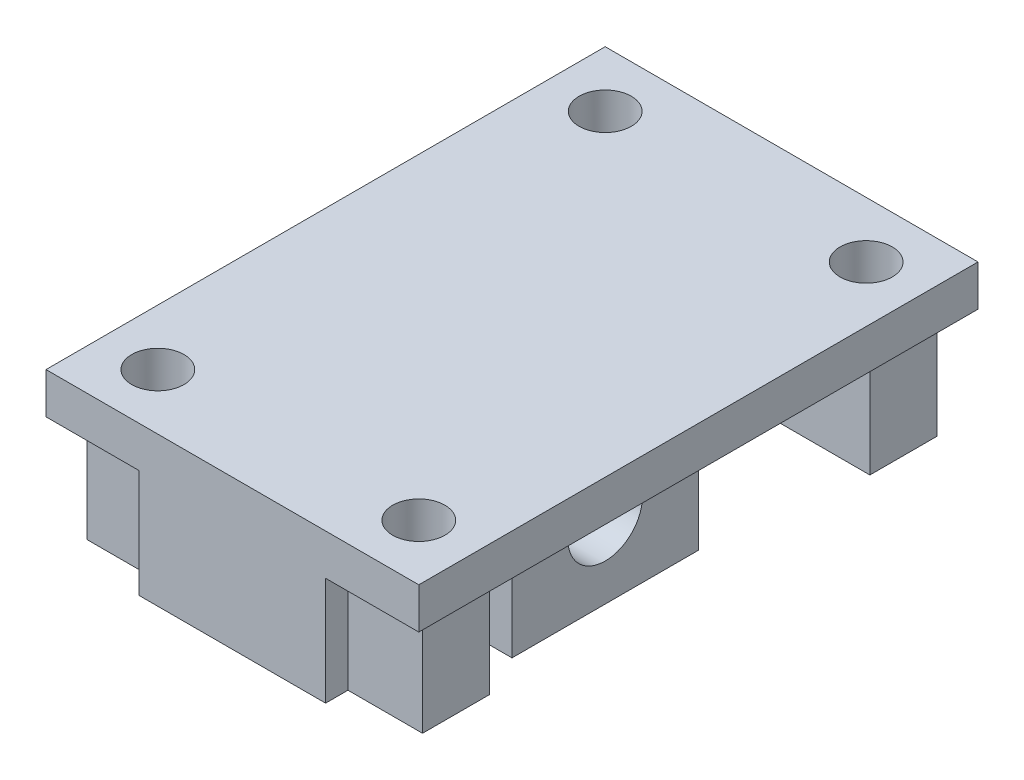
ISO-10303-21;
HEADER;
FILE_DESCRIPTION(('STEP AP214'),'2;1');
FILE_NAME('part.step','',(''),(''),'','','');
FILE_SCHEMA(('AUTOMOTIVE_DESIGN { 1 0 10303 214 1 1 1 1 }'));
ENDSEC;
DATA;
#1=APPLICATION_CONTEXT('core data for automotive mechanical design processes');
#2=APPLICATION_PROTOCOL_DEFINITION('international standard','automotive_design',2000,#1);
#3=PRODUCT_CONTEXT('',#1,'mechanical');
#4=PRODUCT('Part','Part','',(#3));
#5=PRODUCT_RELATED_PRODUCT_CATEGORY('part','',(#4));
#6=PRODUCT_DEFINITION_FORMATION('','',#4);
#7=PRODUCT_DEFINITION_CONTEXT('part definition',#1,'design');
#8=PRODUCT_DEFINITION('design','',#6,#7);
#9=PRODUCT_DEFINITION_SHAPE('','',#8);
#10=(LENGTH_UNIT() NAMED_UNIT(*) SI_UNIT(.MILLI.,.METRE.));
#11=(NAMED_UNIT(*) PLANE_ANGLE_UNIT() SI_UNIT($,.RADIAN.));
#12=(NAMED_UNIT(*) SI_UNIT($,.STERADIAN.) SOLID_ANGLE_UNIT());
#13=UNCERTAINTY_MEASURE_WITH_UNIT(LENGTH_MEASURE(1.E-05),#10,'distance_accuracy_value','');
#14=(GEOMETRIC_REPRESENTATION_CONTEXT(3) GLOBAL_UNCERTAINTY_ASSIGNED_CONTEXT((#13)) GLOBAL_UNIT_ASSIGNED_CONTEXT((#10,
#11,#12)) REPRESENTATION_CONTEXT('',''));
#15=CARTESIAN_POINT('',(0.,0.,0.));
#16=DIRECTION('',(0.,0.,1.));
#17=DIRECTION('',(1.,0.,0.));
#18=AXIS2_PLACEMENT_3D('',#15,#16,#17);
#19=CARTESIAN_POINT('',(5.,4.7,10.2));
#20=DIRECTION('',(0.,1.,0.));
#21=DIRECTION('',(0.,0.,1.));
#22=AXIS2_PLACEMENT_3D('',#19,#20,#21);
#23=PLANE('',#22);
#24=DIRECTION('',(0.,0.,1.));
#25=VECTOR('',#24,1.);
#26=CARTESIAN_POINT('',(5.,4.7,0.));
#27=LINE('',#26,#25);
#28=CARTESIAN_POINT('',(5.,4.7,-5.));
#29=VERTEX_POINT('',#28);
#30=CARTESIAN_POINT('',(5.,4.7,5.));
#31=VERTEX_POINT('',#30);
#32=EDGE_CURVE('E348',#29,#31,#27,.T.);
#33=ORIENTED_EDGE('',*,*,#32,.F.);
#34=DIRECTION('',(-1.,0.,0.));
#35=VECTOR('',#34,1.);
#36=CARTESIAN_POINT('',(5.,4.7,-5.));
#37=LINE('',#36,#35);
#38=CARTESIAN_POINT('',(-5.,4.7,-5.));
#39=VERTEX_POINT('',#38);
#40=EDGE_CURVE('E410',#29,#39,#37,.T.);
#41=ORIENTED_EDGE('',*,*,#40,.T.);
#42=DIRECTION('',(0.,0.,1.));
#43=VECTOR('',#42,1.);
#44=CARTESIAN_POINT('',(-5.,4.7,0.));
#45=LINE('',#44,#43);
#46=CARTESIAN_POINT('',(-5.,4.7,5.));
#47=VERTEX_POINT('',#46);
#48=EDGE_CURVE('E349',#39,#47,#45,.T.);
#49=ORIENTED_EDGE('',*,*,#48,.T.);
#50=DIRECTION('',(-1.,0.,0.));
#51=VECTOR('',#50,1.);
#52=CARTESIAN_POINT('',(5.,4.7,5.));
#53=LINE('',#52,#51);
#54=EDGE_CURVE('E391',#31,#47,#53,.T.);
#55=ORIENTED_EDGE('',*,*,#54,.F.);
#56=EDGE_LOOP('',(#33,#41,#49,#55));
#57=FACE_BOUND('',#56,.T.);
#58=DIRECTION('',(-1.,0.,0.));
#59=VECTOR('',#58,1.);
#60=CARTESIAN_POINT('',(-9.,4.7,13.8));
#61=LINE('',#60,#59);
#62=CARTESIAN_POINT('',(-5.,4.7,13.8));
#63=VERTEX_POINT('',#62);
#64=CARTESIAN_POINT('',(-9.,4.7,13.8));
#65=VERTEX_POINT('',#64);
#66=EDGE_CURVE('E214',#63,#65,#61,.T.);
#67=ORIENTED_EDGE('',*,*,#66,.F.);
#68=CARTESIAN_POINT('',(-5.,4.7,15.));
#69=VERTEX_POINT('',#68);
#70=EDGE_CURVE('E344',#63,#69,#45,.T.);
#71=ORIENTED_EDGE('',*,*,#70,.T.);
#72=DIRECTION('',(-1.,0.,0.));
#73=VECTOR('',#72,1.);
#74=CARTESIAN_POINT('',(10.,4.7,15.));
#75=LINE('',#74,#73);
#76=CARTESIAN_POINT('',(-10.,4.7,15.));
#77=VERTEX_POINT('',#76);
#78=EDGE_CURVE('E340',#69,#77,#75,.T.);
#79=ORIENTED_EDGE('',*,*,#78,.T.);
#80=DIRECTION('',(0.,0.,-1.));
#81=VECTOR('',#80,1.);
#82=CARTESIAN_POINT('',(-10.,4.7,15.));
#83=LINE('',#82,#81);
#84=CARTESIAN_POINT('',(-10.,4.7,-15.));
#85=VERTEX_POINT('',#84);
#86=EDGE_CURVE('E329',#77,#85,#83,.T.);
#87=ORIENTED_EDGE('',*,*,#86,.T.);
#88=DIRECTION('',(-1.,0.,0.));
#89=VECTOR('',#88,1.);
#90=CARTESIAN_POINT('',(10.,4.7,-15.));
#91=LINE('',#90,#89);
#92=CARTESIAN_POINT('',(-5.,4.7,-15.));
#93=VERTEX_POINT('',#92);
#94=EDGE_CURVE('E326',#93,#85,#91,.T.);
#95=ORIENTED_EDGE('',*,*,#94,.F.);
#96=CARTESIAN_POINT('',(-5.,4.69999999999999,-13.8));
#97=VERTEX_POINT('',#96);
#98=EDGE_CURVE('E345',#93,#97,#45,.T.);
#99=ORIENTED_EDGE('',*,*,#98,.T.);
#100=DIRECTION('',(1.,0.,0.));
#101=VECTOR('',#100,1.);
#102=CARTESIAN_POINT('',(-9.,4.69999999999999,-13.8));
#103=LINE('',#102,#101);
#104=CARTESIAN_POINT('',(-9.,4.69999999999999,-13.8));
#105=VERTEX_POINT('',#104);
#106=EDGE_CURVE('E274',#105,#97,#103,.T.);
#107=ORIENTED_EDGE('',*,*,#106,.F.);
#108=DIRECTION('',(0.,0.,-1.));
#109=VECTOR('',#108,1.);
#110=CARTESIAN_POINT('',(-9.,4.69999999999999,-13.8));
#111=LINE('',#110,#109);
#112=CARTESIAN_POINT('',(-9.,4.7,-10.2));
#113=VERTEX_POINT('',#112);
#114=EDGE_CURVE('E279',#113,#105,#111,.T.);
#115=ORIENTED_EDGE('',*,*,#114,.F.);
#116=DIRECTION('',(-1.,0.,0.));
#117=VECTOR('',#116,1.);
#118=CARTESIAN_POINT('',(5.,4.7,-10.2));
#119=LINE('',#118,#117);
#120=CARTESIAN_POINT('',(9.,4.7,-10.2));
#121=VERTEX_POINT('',#120);
#122=EDGE_CURVE('E408',#121,#113,#119,.T.);
#123=ORIENTED_EDGE('',*,*,#122,.F.);
#124=DIRECTION('',(0.,0.,1.));
#125=VECTOR('',#124,1.);
#126=CARTESIAN_POINT('',(9.,4.69999999999999,-13.8));
#127=LINE('',#126,#125);
#128=CARTESIAN_POINT('',(9.,4.69999999999999,-13.8));
#129=VERTEX_POINT('',#128);
#130=EDGE_CURVE('E250',#129,#121,#127,.T.);
#131=ORIENTED_EDGE('',*,*,#130,.F.);
#132=DIRECTION('',(1.,0.,0.));
#133=VECTOR('',#132,1.);
#134=CARTESIAN_POINT('',(9.,4.69999999999999,-13.8));
#135=LINE('',#134,#133);
#136=CARTESIAN_POINT('',(5.,4.7,-13.8));
#137=VERTEX_POINT('',#136);
#138=EDGE_CURVE('E255',#137,#129,#135,.T.);
#139=ORIENTED_EDGE('',*,*,#138,.F.);
#140=CARTESIAN_POINT('',(5.,4.7,-15.));
#141=VERTEX_POINT('',#140);
#142=EDGE_CURVE('E347',#141,#137,#27,.T.);
#143=ORIENTED_EDGE('',*,*,#142,.F.);
#144=CARTESIAN_POINT('',(10.,4.7,-15.));
#145=VERTEX_POINT('',#144);
#146=EDGE_CURVE('E337',#145,#141,#91,.T.);
#147=ORIENTED_EDGE('',*,*,#146,.F.);
#148=DIRECTION('',(0.,0.,-1.));
#149=VECTOR('',#148,1.);
#150=CARTESIAN_POINT('',(10.,4.7,15.));
#151=LINE('',#150,#149);
#152=CARTESIAN_POINT('',(10.,4.7,15.));
#153=VERTEX_POINT('',#152);
#154=EDGE_CURVE('E317',#153,#145,#151,.T.);
#155=ORIENTED_EDGE('',*,*,#154,.F.);
#156=CARTESIAN_POINT('',(5.,4.7,15.));
#157=VERTEX_POINT('',#156);
#158=EDGE_CURVE('E341',#153,#157,#75,.T.);
#159=ORIENTED_EDGE('',*,*,#158,.T.);
#160=CARTESIAN_POINT('',(5.,4.7,13.8));
#161=VERTEX_POINT('',#160);
#162=EDGE_CURVE('E353',#161,#157,#27,.T.);
#163=ORIENTED_EDGE('',*,*,#162,.F.);
#164=DIRECTION('',(-1.,0.,0.));
#165=VECTOR('',#164,1.);
#166=CARTESIAN_POINT('',(9.,4.7,13.8));
#167=LINE('',#166,#165);
#168=CARTESIAN_POINT('',(9.,4.7,13.8));
#169=VERTEX_POINT('',#168);
#170=EDGE_CURVE('E54',#169,#161,#167,.T.);
#171=ORIENTED_EDGE('',*,*,#170,.F.);
#172=DIRECTION('',(0.,0.,1.));
#173=VECTOR('',#172,1.);
#174=CARTESIAN_POINT('',(9.,4.7,13.8));
#175=LINE('',#174,#173);
#176=CARTESIAN_POINT('',(9.,4.7,10.2));
#177=VERTEX_POINT('',#176);
#178=EDGE_CURVE('E233',#177,#169,#175,.T.);
#179=ORIENTED_EDGE('',*,*,#178,.F.);
#180=DIRECTION('',(-1.,0.,0.));
#181=VECTOR('',#180,1.);
#182=CARTESIAN_POINT('',(5.,4.7,10.2));
#183=LINE('',#182,#181);
#184=CARTESIAN_POINT('',(-9.,4.7,10.2));
#185=VERTEX_POINT('',#184);
#186=EDGE_CURVE('E47',#177,#185,#183,.T.);
#187=ORIENTED_EDGE('',*,*,#186,.T.);
#188=DIRECTION('',(0.,0.,-1.));
#189=VECTOR('',#188,1.);
#190=CARTESIAN_POINT('',(-9.,4.7,13.8));
#191=LINE('',#190,#189);
#192=EDGE_CURVE('E218',#65,#185,#191,.T.);
#193=ORIENTED_EDGE('',*,*,#192,.F.);
#194=EDGE_LOOP('',(#67,#71,#79,#87,#95,#99,#107,#115,#123,#131,#139,#143,#147,#155,#159,#163,
#171,#179,#187,#193));
#195=FACE_BOUND('',#194,.T.);
#196=ADVANCED_FACE('F32',(#57,#195),#23,.F.);
#197=CARTESIAN_POINT('',(-5.,0.,0.));
#198=DIRECTION('',(1.,0.,0.));
#199=DIRECTION('',(0.,0.,-1.));
#200=AXIS2_PLACEMENT_3D('',#197,#198,#199);
#201=PLANE('',#200);
#202=DIRECTION('',(0.,1.,0.));
#203=VECTOR('',#202,1.);
#204=CARTESIAN_POINT('',(-5.,-6.48463598976147,13.8));
#205=LINE('',#204,#203);
#206=CARTESIAN_POINT('',(-5.,-1.10318637093199,13.8));
#207=VERTEX_POINT('',#206);
#208=EDGE_CURVE('E207',#207,#63,#205,.T.);
#209=ORIENTED_EDGE('',*,*,#208,.F.);
#210=DIRECTION('',(0.,0.,-1.));
#211=VECTOR('',#210,1.);
#212=CARTESIAN_POINT('',(-5.,-1.10318637093199,15.));
#213=LINE('',#212,#211);
#214=CARTESIAN_POINT('',(-5.,-1.10318637093199,15.));
#215=VERTEX_POINT('',#214);
#216=EDGE_CURVE('E204',#215,#207,#213,.T.);
#217=ORIENTED_EDGE('',*,*,#216,.F.);
#218=DIRECTION('',(0.,-1.,0.));
#219=VECTOR('',#218,1.);
#220=CARTESIAN_POINT('',(-5.,6.89681362906801,15.));
#221=LINE('',#220,#219);
#222=EDGE_CURVE('E380',#69,#215,#221,.T.);
#223=ORIENTED_EDGE('',*,*,#222,.F.);
#224=ORIENTED_EDGE('',*,*,#70,.F.);
#225=EDGE_LOOP('',(#209,#217,#223,#224));
#226=FACE_BOUND('',#225,.T.);
#227=ADVANCED_FACE('F431',(#226),#201,.F.);
#228=CARTESIAN_POINT('',(5.,0.,0.));
#229=DIRECTION('',(1.,0.,0.));
#230=DIRECTION('',(0.,0.,-1.));
#231=AXIS2_PLACEMENT_3D('',#228,#229,#230);
#232=PLANE('',#231);
#233=DIRECTION('',(0.,0.,-1.));
#234=VECTOR('',#233,1.);
#235=CARTESIAN_POINT('',(5.,-1.10318637093199,15.));
#236=LINE('',#235,#234);
#237=CARTESIAN_POINT('',(5.,-1.10318637093199,15.));
#238=VERTEX_POINT('',#237);
#239=CARTESIAN_POINT('',(5.,-1.10318637093199,13.8));
#240=VERTEX_POINT('',#239);
#241=EDGE_CURVE('E366',#238,#240,#236,.T.);
#242=ORIENTED_EDGE('',*,*,#241,.T.);
#243=DIRECTION('',(0.,1.,0.));
#244=VECTOR('',#243,1.);
#245=CARTESIAN_POINT('',(5.,-6.48463598976147,13.8));
#246=LINE('',#245,#244);
#247=EDGE_CURVE('E229',#240,#161,#246,.T.);
#248=ORIENTED_EDGE('',*,*,#247,.T.);
#249=ORIENTED_EDGE('',*,*,#162,.T.);
#250=DIRECTION('',(0.,-1.,0.));
#251=VECTOR('',#250,1.);
#252=CARTESIAN_POINT('',(5.,6.89681362906801,15.));
#253=LINE('',#252,#251);
#254=EDGE_CURVE('E364',#157,#238,#253,.T.);
#255=ORIENTED_EDGE('',*,*,#254,.T.);
#256=EDGE_LOOP('',(#242,#248,#249,#255));
#257=FACE_BOUND('',#256,.T.);
#258=ADVANCED_FACE('F438',(#257),#232,.T.);
#259=ORIENTED_EDGE('',*,*,#142,.T.);
#260=DIRECTION('',(0.,1.,0.));
#261=VECTOR('',#260,1.);
#262=CARTESIAN_POINT('',(5.,-6.48463598976148,-13.8));
#263=LINE('',#262,#261);
#264=CARTESIAN_POINT('',(5.,-1.10318637093199,-13.8));
#265=VERTEX_POINT('',#264);
#266=EDGE_CURVE('E259',#265,#137,#263,.T.);
#267=ORIENTED_EDGE('',*,*,#266,.F.);
#268=DIRECTION('',(0.,0.,-1.));
#269=VECTOR('',#268,1.);
#270=CARTESIAN_POINT('',(5.,-1.10318637093199,-15.));
#271=LINE('',#270,#269);
#272=CARTESIAN_POINT('',(5.,-1.10318637093199,-15.));
#273=VERTEX_POINT('',#272);
#274=EDGE_CURVE('E359',#265,#273,#271,.T.);
#275=ORIENTED_EDGE('',*,*,#274,.T.);
#276=DIRECTION('',(0.,1.,0.));
#277=VECTOR('',#276,1.);
#278=CARTESIAN_POINT('',(5.,6.89681362906801,-15.));
#279=LINE('',#278,#277);
#280=EDGE_CURVE('E362',#273,#141,#279,.T.);
#281=ORIENTED_EDGE('',*,*,#280,.T.);
#282=EDGE_LOOP('',(#259,#267,#275,#281));
#283=FACE_BOUND('',#282,.T.);
#284=ADVANCED_FACE('F455',(#283),#232,.T.);
#285=DIRECTION('',(0.,1.,0.));
#286=VECTOR('',#285,1.);
#287=CARTESIAN_POINT('',(-5.,-6.48463598976148,-13.8));
#288=LINE('',#287,#286);
#289=CARTESIAN_POINT('',(-5.,-1.10318637093199,-13.8));
#290=VERTEX_POINT('',#289);
#291=EDGE_CURVE('E286',#290,#97,#288,.T.);
#292=ORIENTED_EDGE('',*,*,#291,.T.);
#293=ORIENTED_EDGE('',*,*,#98,.F.);
#294=DIRECTION('',(0.,1.,0.));
#295=VECTOR('',#294,1.);
#296=CARTESIAN_POINT('',(-5.,6.89681362906801,-15.));
#297=LINE('',#296,#295);
#298=CARTESIAN_POINT('',(-5.,-1.10318637093199,-15.));
#299=VERTEX_POINT('',#298);
#300=EDGE_CURVE('E377',#299,#93,#297,.T.);
#301=ORIENTED_EDGE('',*,*,#300,.F.);
#302=DIRECTION('',(0.,0.,-1.));
#303=VECTOR('',#302,1.);
#304=CARTESIAN_POINT('',(-5.,-1.10318637093199,-15.));
#305=LINE('',#304,#303);
#306=EDGE_CURVE('E375',#290,#299,#305,.T.);
#307=ORIENTED_EDGE('',*,*,#306,.F.);
#308=EDGE_LOOP('',(#292,#293,#301,#307));
#309=FACE_BOUND('',#308,.T.);
#310=ADVANCED_FACE('F442',(#309),#201,.F.);
#311=CARTESIAN_POINT('',(-7.,4.7,-12.));
#312=DIRECTION('',(0.,1.,0.));
#313=DIRECTION('',(0.,0.,1.));
#314=AXIS2_PLACEMENT_3D('',#311,#312,#313);
#315=CIRCLE('',#314,1.4);
#316=CARTESIAN_POINT('',(-7.,4.7,-10.6));
#317=VERTEX_POINT('',#316);
#318=EDGE_CURVE('E300',#317,#317,#315,.F.);
#319=ORIENTED_EDGE('',*,*,#318,.F.);
#320=EDGE_LOOP('',(#319));
#321=FACE_BOUND('',#320,.T.);
#322=CARTESIAN_POINT('',(-7.,4.7,-12.));
#323=DIRECTION('',(0.,-1.,0.));
#324=DIRECTION('',(0.,0.,-1.));
#325=AXIS2_PLACEMENT_3D('',#322,#323,#324);
#326=CIRCLE('',#325,1.42426076504242);
#327=CARTESIAN_POINT('',(-7.,4.7,-13.4242607650424));
#328=VERTEX_POINT('',#327);
#329=EDGE_CURVE('E273',#328,#328,#326,.T.);
#330=ORIENTED_EDGE('',*,*,#329,.T.);
#331=EDGE_LOOP('',(#330));
#332=FACE_BOUND('',#331,.T.);
#333=ADVANCED_FACE('F434',(#321,#332),#23,.F.);
#334=CARTESIAN_POINT('',(5.,0.,0.));
#335=DIRECTION('',(1.,0.,0.));
#336=DIRECTION('',(0.,0.,-1.));
#337=AXIS2_PLACEMENT_3D('',#334,#335,#336);
#338=CIRCLE('',#337,2.);
#339=CARTESIAN_POINT('',(5.,0.,-2.));
#340=VERTEX_POINT('',#339);
#341=EDGE_CURVE('E352',#340,#340,#338,.T.);
#342=ORIENTED_EDGE('',*,*,#341,.F.);
#343=EDGE_LOOP('',(#342));
#344=FACE_BOUND('',#343,.T.);
#345=DIRECTION('',(0.,1.,0.));
#346=VECTOR('',#345,1.);
#347=CARTESIAN_POINT('',(5.,4.7,-5.));
#348=LINE('',#347,#346);
#349=CARTESIAN_POINT('',(5.,-4.,-5.));
#350=VERTEX_POINT('',#349);
#351=EDGE_CURVE('E357',#350,#29,#348,.T.);
#352=ORIENTED_EDGE('',*,*,#351,.T.);
#353=ORIENTED_EDGE('',*,*,#32,.T.);
#354=DIRECTION('',(0.,-1.,0.));
#355=VECTOR('',#354,1.);
#356=CARTESIAN_POINT('',(5.,4.7,5.));
#357=LINE('',#356,#355);
#358=CARTESIAN_POINT('',(5.,-4.,5.));
#359=VERTEX_POINT('',#358);
#360=EDGE_CURVE('E368',#31,#359,#357,.T.);
#361=ORIENTED_EDGE('',*,*,#360,.T.);
#362=DIRECTION('',(0.,0.,-1.));
#363=VECTOR('',#362,1.);
#364=CARTESIAN_POINT('',(5.,-4.,5.));
#365=LINE('',#364,#363);
#366=EDGE_CURVE('E370',#359,#350,#365,.T.);
#367=ORIENTED_EDGE('',*,*,#366,.T.);
#368=EDGE_LOOP('',(#352,#353,#361,#367));
#369=FACE_BOUND('',#368,.T.);
#370=ADVANCED_FACE('F447',(#344,#369),#232,.T.);
#371=CARTESIAN_POINT('',(-5.,0.,0.));
#372=DIRECTION('',(-1.,0.,0.));
#373=DIRECTION('',(0.,0.,1.));
#374=AXIS2_PLACEMENT_3D('',#371,#372,#373);
#375=CIRCLE('',#374,2.9);
#376=CARTESIAN_POINT('',(-5.,0.,2.9));
#377=VERTEX_POINT('',#376);
#378=EDGE_CURVE('E545',#377,#377,#375,.T.);
#379=ORIENTED_EDGE('',*,*,#378,.F.);
#380=EDGE_LOOP('',(#379));
#381=FACE_BOUND('',#380,.T.);
#382=ORIENTED_EDGE('',*,*,#48,.F.);
#383=DIRECTION('',(0.,1.,0.));
#384=VECTOR('',#383,1.);
#385=CARTESIAN_POINT('',(-5.,4.7,-5.));
#386=LINE('',#385,#384);
#387=CARTESIAN_POINT('',(-5.,-4.,-5.));
#388=VERTEX_POINT('',#387);
#389=EDGE_CURVE('E356',#388,#39,#386,.T.);
#390=ORIENTED_EDGE('',*,*,#389,.F.);
#391=DIRECTION('',(0.,0.,-1.));
#392=VECTOR('',#391,1.);
#393=CARTESIAN_POINT('',(-5.,-4.,5.));
#394=LINE('',#393,#392);
#395=CARTESIAN_POINT('',(-5.,-4.,5.));
#396=VERTEX_POINT('',#395);
#397=EDGE_CURVE('E360',#396,#388,#394,.T.);
#398=ORIENTED_EDGE('',*,*,#397,.F.);
#399=DIRECTION('',(0.,-1.,0.));
#400=VECTOR('',#399,1.);
#401=CARTESIAN_POINT('',(-5.,4.7,5.));
#402=LINE('',#401,#400);
#403=EDGE_CURVE('E383',#47,#396,#402,.T.);
#404=ORIENTED_EDGE('',*,*,#403,.F.);
#405=EDGE_LOOP('',(#382,#390,#398,#404));
#406=FACE_BOUND('',#405,.T.);
#407=ADVANCED_FACE('F441',(#381,#406),#201,.F.);
#408=CARTESIAN_POINT('',(5.,4.7,-5.));
#409=DIRECTION('',(0.,0.,1.));
#410=DIRECTION('',(0.,-1.,0.));
#411=AXIS2_PLACEMENT_3D('',#408,#409,#410);
#412=PLANE('',#411);
#413=ORIENTED_EDGE('',*,*,#389,.T.);
#414=ORIENTED_EDGE('',*,*,#40,.F.);
#415=ORIENTED_EDGE('',*,*,#351,.F.);
#416=DIRECTION('',(-1.,0.,0.));
#417=VECTOR('',#416,1.);
#418=CARTESIAN_POINT('',(5.,-4.,-5.));
#419=LINE('',#418,#417);
#420=EDGE_CURVE('E372',#350,#388,#419,.T.);
#421=ORIENTED_EDGE('',*,*,#420,.T.);
#422=EDGE_LOOP('',(#413,#414,#415,#421));
#423=FACE_BOUND('',#422,.T.);
#424=ADVANCED_FACE('F531',(#423),#412,.F.);
#425=CARTESIAN_POINT('',(5.,-1.10318637093199,-10.2));
#426=DIRECTION('',(0.,0.,-1.));
#427=DIRECTION('',(-1.,0.,0.));
#428=AXIS2_PLACEMENT_3D('',#425,#426,#427);
#429=PLANE('',#428);
#430=ORIENTED_EDGE('',*,*,#122,.T.);
#431=DIRECTION('',(0.,1.,0.));
#432=VECTOR('',#431,1.);
#433=CARTESIAN_POINT('',(-9.,-6.48463598976148,-10.2));
#434=LINE('',#433,#432);
#435=CARTESIAN_POINT('',(-9.,-1.10318637093199,-10.2));
#436=VERTEX_POINT('',#435);
#437=EDGE_CURVE('E283',#436,#113,#434,.T.);
#438=ORIENTED_EDGE('',*,*,#437,.F.);
#439=DIRECTION('',(-1.,0.,0.));
#440=VECTOR('',#439,1.);
#441=CARTESIAN_POINT('',(5.,-1.10318637093199,-10.2));
#442=LINE('',#441,#440);
#443=CARTESIAN_POINT('',(9.,-1.10318637093199,-10.2));
#444=VERTEX_POINT('',#443);
#445=EDGE_CURVE('E406',#444,#436,#442,.T.);
#446=ORIENTED_EDGE('',*,*,#445,.F.);
#447=DIRECTION('',(0.,1.,0.));
#448=VECTOR('',#447,1.);
#449=CARTESIAN_POINT('',(9.,-6.48463598976148,-10.2));
#450=LINE('',#449,#448);
#451=EDGE_CURVE('E253',#444,#121,#450,.T.);
#452=ORIENTED_EDGE('',*,*,#451,.T.);
#453=EDGE_LOOP('',(#430,#438,#446,#452));
#454=FACE_BOUND('',#453,.T.);
#455=ADVANCED_FACE('F572',(#454),#429,.F.);
#456=CARTESIAN_POINT('',(5.,-1.10318637093199,-15.));
#457=DIRECTION('',(0.,1.,0.));
#458=DIRECTION('',(0.,0.,1.));
#459=AXIS2_PLACEMENT_3D('',#456,#457,#458);
#460=PLANE('',#459);
#461=ORIENTED_EDGE('',*,*,#445,.T.);
#462=DIRECTION('',(0.,0.,1.));
#463=VECTOR('',#462,1.);
#464=CARTESIAN_POINT('',(-9.,-1.10318637093199,-13.8));
#465=LINE('',#464,#463);
#466=CARTESIAN_POINT('',(-9.,-1.10318637093199,-13.8));
#467=VERTEX_POINT('',#466);
#468=EDGE_CURVE('E289',#467,#436,#465,.T.);
#469=ORIENTED_EDGE('',*,*,#468,.F.);
#470=DIRECTION('',(-1.,0.,0.));
#471=VECTOR('',#470,1.);
#472=CARTESIAN_POINT('',(-9.,-1.10318637093199,-13.8));
#473=LINE('',#472,#471);
#474=EDGE_CURVE('E282',#290,#467,#473,.T.);
#475=ORIENTED_EDGE('',*,*,#474,.F.);
#476=ORIENTED_EDGE('',*,*,#306,.T.);
#477=DIRECTION('',(-1.,0.,0.));
#478=VECTOR('',#477,1.);
#479=CARTESIAN_POINT('',(5.,-1.10318637093199,-15.));
#480=LINE('',#479,#478);
#481=EDGE_CURVE('E403',#273,#299,#480,.T.);
#482=ORIENTED_EDGE('',*,*,#481,.F.);
#483=ORIENTED_EDGE('',*,*,#274,.F.);
#484=DIRECTION('',(-1.,0.,0.));
#485=VECTOR('',#484,1.);
#486=CARTESIAN_POINT('',(9.,-1.10318637093199,-13.8));
#487=LINE('',#486,#485);
#488=CARTESIAN_POINT('',(9.,-1.10318637093199,-13.8));
#489=VERTEX_POINT('',#488);
#490=EDGE_CURVE('E249',#489,#265,#487,.T.);
#491=ORIENTED_EDGE('',*,*,#490,.F.);
#492=DIRECTION('',(0.,0.,-1.));
#493=VECTOR('',#492,1.);
#494=CARTESIAN_POINT('',(9.,-1.10318637093199,-13.8));
#495=LINE('',#494,#493);
#496=EDGE_CURVE('E258',#444,#489,#495,.T.);
#497=ORIENTED_EDGE('',*,*,#496,.F.);
#498=EDGE_LOOP('',(#461,#469,#475,#476,#482,#483,#491,#497));
#499=FACE_BOUND('',#498,.T.);
#500=CARTESIAN_POINT('',(-7.,-1.10318637093199,-12.));
#501=DIRECTION('',(0.,1.,0.));
#502=DIRECTION('',(0.,0.,1.));
#503=AXIS2_PLACEMENT_3D('',#500,#501,#502);
#504=CIRCLE('',#503,1.42426076504242);
#505=CARTESIAN_POINT('',(-7.,-1.10318637093199,-10.5757392349576));
#506=VERTEX_POINT('',#505);
#507=EDGE_CURVE('E277',#506,#506,#504,.T.);
#508=ORIENTED_EDGE('',*,*,#507,.T.);
#509=EDGE_LOOP('',(#508));
#510=FACE_BOUND('',#509,.T.);
#511=CARTESIAN_POINT('',(7.,-1.10318637093199,-12.));
#512=DIRECTION('',(0.,1.,0.));
#513=DIRECTION('',(0.,0.,1.));
#514=AXIS2_PLACEMENT_3D('',#511,#512,#513);
#515=CIRCLE('',#514,1.4);
#516=CARTESIAN_POINT('',(7.,-1.10318637093199,-10.6));
#517=VERTEX_POINT('',#516);
#518=EDGE_CURVE('E266',#517,#517,#515,.T.);
#519=ORIENTED_EDGE('',*,*,#518,.T.);
#520=EDGE_LOOP('',(#519));
#521=FACE_BOUND('',#520,.T.);
#522=ADVANCED_FACE('F576',(#499,#510,#521),#460,.F.);
#523=CARTESIAN_POINT('',(5.,6.89681362906801,-15.));
#524=DIRECTION('',(0.,0.,1.));
#525=DIRECTION('',(0.,-1.,0.));
#526=AXIS2_PLACEMENT_3D('',#523,#524,#525);
#527=PLANE('',#526);
#528=DIRECTION('',(-1.,0.,0.));
#529=VECTOR('',#528,1.);
#530=CARTESIAN_POINT('',(5.,6.89681362906801,-15.));
#531=LINE('',#530,#529);
#532=CARTESIAN_POINT('',(10.,6.89681362906801,-15.));
#533=VERTEX_POINT('',#532);
#534=CARTESIAN_POINT('',(-10.,6.89681362906801,-15.));
#535=VERTEX_POINT('',#534);
#536=EDGE_CURVE('E401',#533,#535,#531,.T.);
#537=ORIENTED_EDGE('',*,*,#536,.F.);
#538=DIRECTION('',(0.,1.,0.));
#539=VECTOR('',#538,1.);
#540=CARTESIAN_POINT('',(10.,6.89681362906801,-15.));
#541=LINE('',#540,#539);
#542=EDGE_CURVE('E320',#145,#533,#541,.T.);
#543=ORIENTED_EDGE('',*,*,#542,.F.);
#544=ORIENTED_EDGE('',*,*,#146,.T.);
#545=ORIENTED_EDGE('',*,*,#280,.F.);
#546=ORIENTED_EDGE('',*,*,#481,.T.);
#547=ORIENTED_EDGE('',*,*,#300,.T.);
#548=ORIENTED_EDGE('',*,*,#94,.T.);
#549=DIRECTION('',(0.,1.,0.));
#550=VECTOR('',#549,1.);
#551=CARTESIAN_POINT('',(-10.,6.89681362906801,-15.));
#552=LINE('',#551,#550);
#553=EDGE_CURVE('E332',#85,#535,#552,.T.);
#554=ORIENTED_EDGE('',*,*,#553,.T.);
#555=EDGE_LOOP('',(#537,#543,#544,#545,#546,#547,#548,#554));
#556=FACE_BOUND('',#555,.T.);
#557=ADVANCED_FACE('F582',(#556),#527,.F.);
#558=CARTESIAN_POINT('',(5.,6.89681362906801,-15.));
#559=DIRECTION('',(0.,-1.,0.));
#560=DIRECTION('',(0.,0.,-1.));
#561=AXIS2_PLACEMENT_3D('',#558,#559,#560);
#562=PLANE('',#561);
#563=CARTESIAN_POINT('',(-7.,6.89681362906801,-12.));
#564=DIRECTION('',(0.,-1.,0.));
#565=DIRECTION('',(0.,0.,-1.));
#566=AXIS2_PLACEMENT_3D('',#563,#564,#565);
#567=CIRCLE('',#566,1.4);
#568=CARTESIAN_POINT('',(-7.,6.89681362906801,-13.4));
#569=VERTEX_POINT('',#568);
#570=EDGE_CURVE('E301',#569,#569,#567,.F.);
#571=ORIENTED_EDGE('',*,*,#570,.F.);
#572=EDGE_LOOP('',(#571));
#573=FACE_BOUND('',#572,.T.);
#574=CARTESIAN_POINT('',(7.,6.89681362906801,-12.));
#575=DIRECTION('',(0.,-1.,0.));
#576=DIRECTION('',(0.,0.,-1.));
#577=AXIS2_PLACEMENT_3D('',#574,#575,#576);
#578=CIRCLE('',#577,1.4);
#579=CARTESIAN_POINT('',(7.,6.89681362906801,-13.4));
#580=VERTEX_POINT('',#579);
#581=EDGE_CURVE('E304',#580,#580,#578,.F.);
#582=ORIENTED_EDGE('',*,*,#581,.F.);
#583=EDGE_LOOP('',(#582));
#584=FACE_BOUND('',#583,.T.);
#585=CARTESIAN_POINT('',(7.,6.89681362906801,12.));
#586=DIRECTION('',(0.,-1.,0.));
#587=DIRECTION('',(0.,0.,-1.));
#588=AXIS2_PLACEMENT_3D('',#585,#586,#587);
#589=CIRCLE('',#588,1.4);
#590=CARTESIAN_POINT('',(7.,6.89681362906801,10.6));
#591=VERTEX_POINT('',#590);
#592=EDGE_CURVE('E307',#591,#591,#589,.F.);
#593=ORIENTED_EDGE('',*,*,#592,.F.);
#594=EDGE_LOOP('',(#593));
#595=FACE_BOUND('',#594,.T.);
#596=CARTESIAN_POINT('',(-7.,6.89681362906801,12.));
#597=DIRECTION('',(0.,-1.,0.));
#598=DIRECTION('',(0.,0.,-1.));
#599=AXIS2_PLACEMENT_3D('',#596,#597,#598);
#600=CIRCLE('',#599,1.4);
#601=CARTESIAN_POINT('',(-7.,6.89681362906801,10.6));
#602=VERTEX_POINT('',#601);
#603=EDGE_CURVE('E310',#602,#602,#600,.F.);
#604=ORIENTED_EDGE('',*,*,#603,.F.);
#605=EDGE_LOOP('',(#604));
#606=FACE_BOUND('',#605,.T.);
#607=ORIENTED_EDGE('',*,*,#536,.T.);
#608=DIRECTION('',(0.,0.,1.));
#609=VECTOR('',#608,1.);
#610=CARTESIAN_POINT('',(-10.,6.89681362906801,15.));
#611=LINE('',#610,#609);
#612=CARTESIAN_POINT('',(-10.,6.89681362906801,15.));
#613=VERTEX_POINT('',#612);
#614=EDGE_CURVE('E318',#535,#613,#611,.T.);
#615=ORIENTED_EDGE('',*,*,#614,.T.);
#616=DIRECTION('',(-1.,0.,0.));
#617=VECTOR('',#616,1.);
#618=CARTESIAN_POINT('',(5.,6.89681362906801,15.));
#619=LINE('',#618,#617);
#620=CARTESIAN_POINT('',(10.,6.89681362906801,15.));
#621=VERTEX_POINT('',#620);
#622=EDGE_CURVE('E399',#621,#613,#619,.T.);
#623=ORIENTED_EDGE('',*,*,#622,.F.);
#624=DIRECTION('',(0.,0.,1.));
#625=VECTOR('',#624,1.);
#626=CARTESIAN_POINT('',(10.,6.89681362906801,15.));
#627=LINE('',#626,#625);
#628=EDGE_CURVE('E323',#533,#621,#627,.T.);
#629=ORIENTED_EDGE('',*,*,#628,.F.);
#630=EDGE_LOOP('',(#607,#615,#623,#629));
#631=FACE_BOUND('',#630,.T.);
#632=ADVANCED_FACE('F586',(#573,#584,#595,#606,#631),#562,.F.);
#633=CARTESIAN_POINT('',(5.,6.89681362906801,15.));
#634=DIRECTION('',(0.,0.,-1.));
#635=DIRECTION('',(0.,1.,0.));
#636=AXIS2_PLACEMENT_3D('',#633,#634,#635);
#637=PLANE('',#636);
#638=ORIENTED_EDGE('',*,*,#622,.T.);
#639=DIRECTION('',(0.,-1.,0.));
#640=VECTOR('',#639,1.);
#641=CARTESIAN_POINT('',(-10.,6.89681362906801,15.));
#642=LINE('',#641,#640);
#643=EDGE_CURVE('E313',#613,#77,#642,.T.);
#644=ORIENTED_EDGE('',*,*,#643,.T.);
#645=ORIENTED_EDGE('',*,*,#78,.F.);
#646=ORIENTED_EDGE('',*,*,#222,.T.);
#647=DIRECTION('',(-1.,0.,0.));
#648=VECTOR('',#647,1.);
#649=CARTESIAN_POINT('',(5.,-1.10318637093199,15.));
#650=LINE('',#649,#648);
#651=EDGE_CURVE('E397',#238,#215,#650,.T.);
#652=ORIENTED_EDGE('',*,*,#651,.F.);
#653=ORIENTED_EDGE('',*,*,#254,.F.);
#654=ORIENTED_EDGE('',*,*,#158,.F.);
#655=DIRECTION('',(0.,-1.,0.));
#656=VECTOR('',#655,1.);
#657=CARTESIAN_POINT('',(10.,6.89681362906801,15.));
#658=LINE('',#657,#656);
#659=EDGE_CURVE('E314',#621,#153,#658,.T.);
#660=ORIENTED_EDGE('',*,*,#659,.F.);
#661=EDGE_LOOP('',(#638,#644,#645,#646,#652,#653,#654,#660));
#662=FACE_BOUND('',#661,.T.);
#663=ADVANCED_FACE('F539',(#662),#637,.F.);
#664=CARTESIAN_POINT('',(5.,-1.10318637093199,15.));
#665=DIRECTION('',(0.,1.,0.));
#666=DIRECTION('',(0.,0.,1.));
#667=AXIS2_PLACEMENT_3D('',#664,#665,#666);
#668=PLANE('',#667);
#669=ORIENTED_EDGE('',*,*,#216,.T.);
#670=DIRECTION('',(1.,0.,0.));
#671=VECTOR('',#670,1.);
#672=CARTESIAN_POINT('',(-9.,-1.10318637093199,13.8));
#673=LINE('',#672,#671);
#674=CARTESIAN_POINT('',(-9.,-1.10318637093199,13.8));
#675=VERTEX_POINT('',#674);
#676=EDGE_CURVE('E195',#675,#207,#673,.T.);
#677=ORIENTED_EDGE('',*,*,#676,.F.);
#678=DIRECTION('',(0.,0.,1.));
#679=VECTOR('',#678,1.);
#680=CARTESIAN_POINT('',(-9.,-1.10318637093199,13.8));
#681=LINE('',#680,#679);
#682=CARTESIAN_POINT('',(-9.,-1.10318637093199,10.2));
#683=VERTEX_POINT('',#682);
#684=EDGE_CURVE('E200',#683,#675,#681,.T.);
#685=ORIENTED_EDGE('',*,*,#684,.F.);
#686=DIRECTION('',(-1.,0.,0.));
#687=VECTOR('',#686,1.);
#688=CARTESIAN_POINT('',(5.,-1.10318637093199,10.2));
#689=LINE('',#688,#687);
#690=CARTESIAN_POINT('',(9.,-1.10318637093199,10.2));
#691=VERTEX_POINT('',#690);
#692=EDGE_CURVE('E395',#691,#683,#689,.T.);
#693=ORIENTED_EDGE('',*,*,#692,.F.);
#694=DIRECTION('',(0.,0.,-1.));
#695=VECTOR('',#694,1.);
#696=CARTESIAN_POINT('',(9.,-1.10318637093199,13.8));
#697=LINE('',#696,#695);
#698=CARTESIAN_POINT('',(9.,-1.10318637093199,13.8));
#699=VERTEX_POINT('',#698);
#700=EDGE_CURVE('E240',#699,#691,#697,.T.);
#701=ORIENTED_EDGE('',*,*,#700,.F.);
#702=DIRECTION('',(1.,0.,0.));
#703=VECTOR('',#702,1.);
#704=CARTESIAN_POINT('',(9.,-1.10318637093199,13.8));
#705=LINE('',#704,#703);
#706=EDGE_CURVE('E236',#240,#699,#705,.T.);
#707=ORIENTED_EDGE('',*,*,#706,.F.);
#708=ORIENTED_EDGE('',*,*,#241,.F.);
#709=ORIENTED_EDGE('',*,*,#651,.T.);
#710=EDGE_LOOP('',(#669,#677,#685,#693,#701,#707,#708,#709));
#711=FACE_BOUND('',#710,.T.);
#712=CARTESIAN_POINT('',(7.,-1.10318637093199,12.));
#713=DIRECTION('',(0.,1.,0.));
#714=DIRECTION('',(0.,0.,1.));
#715=AXIS2_PLACEMENT_3D('',#712,#713,#714);
#716=CIRCLE('',#715,1.4);
#717=CARTESIAN_POINT('',(7.,-1.10318637093199,13.4));
#718=VERTEX_POINT('',#717);
#719=EDGE_CURVE('E231',#718,#718,#716,.T.);
#720=ORIENTED_EDGE('',*,*,#719,.T.);
#721=EDGE_LOOP('',(#720));
#722=FACE_BOUND('',#721,.T.);
#723=CARTESIAN_POINT('',(-7.,-1.10318637093199,12.));
#724=DIRECTION('',(0.,1.,0.));
#725=DIRECTION('',(0.,0.,1.));
#726=AXIS2_PLACEMENT_3D('',#723,#724,#725);
#727=CIRCLE('',#726,1.4);
#728=CARTESIAN_POINT('',(-7.,-1.10318637093199,13.4));
#729=VERTEX_POINT('',#728);
#730=EDGE_CURVE('E226',#729,#729,#727,.T.);
#731=ORIENTED_EDGE('',*,*,#730,.T.);
#732=EDGE_LOOP('',(#731));
#733=FACE_BOUND('',#732,.T.);
#734=ADVANCED_FACE('F197',(#711,#722,#733),#668,.F.);
#735=CARTESIAN_POINT('',(5.,-1.10318637093199,10.2));
#736=DIRECTION('',(0.,0.,1.));
#737=DIRECTION('',(1.,0.,0.));
#738=AXIS2_PLACEMENT_3D('',#735,#736,#737);
#739=PLANE('',#738);
#740=ORIENTED_EDGE('',*,*,#692,.T.);
#741=DIRECTION('',(0.,1.,0.));
#742=VECTOR('',#741,1.);
#743=CARTESIAN_POINT('',(-9.,-6.48463598976147,10.2));
#744=LINE('',#743,#742);
#745=EDGE_CURVE('E221',#683,#185,#744,.T.);
#746=ORIENTED_EDGE('',*,*,#745,.T.);
#747=ORIENTED_EDGE('',*,*,#186,.F.);
#748=DIRECTION('',(0.,1.,0.));
#749=VECTOR('',#748,1.);
#750=CARTESIAN_POINT('',(9.,-6.48463598976147,10.2));
#751=LINE('',#750,#749);
#752=EDGE_CURVE('E237',#691,#177,#751,.T.);
#753=ORIENTED_EDGE('',*,*,#752,.F.);
#754=EDGE_LOOP('',(#740,#746,#747,#753));
#755=FACE_BOUND('',#754,.T.);
#756=ADVANCED_FACE('F515',(#755),#739,.F.);
#757=CARTESIAN_POINT('',(5.,4.7,5.));
#758=DIRECTION('',(0.,0.,-1.));
#759=DIRECTION('',(0.,1.,0.));
#760=AXIS2_PLACEMENT_3D('',#757,#758,#759);
#761=PLANE('',#760);
#762=ORIENTED_EDGE('',*,*,#403,.T.);
#763=DIRECTION('',(-1.,0.,0.));
#764=VECTOR('',#763,1.);
#765=CARTESIAN_POINT('',(5.,-4.,5.));
#766=LINE('',#765,#764);
#767=EDGE_CURVE('E388',#359,#396,#766,.T.);
#768=ORIENTED_EDGE('',*,*,#767,.F.);
#769=ORIENTED_EDGE('',*,*,#360,.F.);
#770=ORIENTED_EDGE('',*,*,#54,.T.);
#771=EDGE_LOOP('',(#762,#768,#769,#770));
#772=FACE_BOUND('',#771,.T.);
#773=ADVANCED_FACE('F512',(#772),#761,.F.);
#774=CARTESIAN_POINT('',(5.,-4.,5.));
#775=DIRECTION('',(0.,1.,0.));
#776=DIRECTION('',(0.,0.,1.));
#777=AXIS2_PLACEMENT_3D('',#774,#775,#776);
#778=PLANE('',#777);
#779=ORIENTED_EDGE('',*,*,#397,.T.);
#780=ORIENTED_EDGE('',*,*,#420,.F.);
#781=ORIENTED_EDGE('',*,*,#366,.F.);
#782=ORIENTED_EDGE('',*,*,#767,.T.);
#783=EDGE_LOOP('',(#779,#780,#781,#782));
#784=FACE_BOUND('',#783,.T.);
#785=ADVANCED_FACE('F506',(#784),#778,.F.);
#786=CARTESIAN_POINT('',(5.,0.,0.));
#787=DIRECTION('',(-1.,0.,0.));
#788=DIRECTION('',(0.,0.,1.));
#789=AXIS2_PLACEMENT_3D('',#786,#787,#788);
#790=CYLINDRICAL_SURFACE('',#789,2.);
#791=CARTESIAN_POINT('',(2.,0.,0.));
#792=DIRECTION('',(1.,0.,0.));
#793=DIRECTION('',(0.,0.,-1.));
#794=AXIS2_PLACEMENT_3D('',#791,#792,#793);
#795=CIRCLE('',#794,2.);
#796=CARTESIAN_POINT('',(2.,0.,-2.));
#797=VERTEX_POINT('',#796);
#798=EDGE_CURVE('E413',#797,#797,#795,.T.);
#799=ORIENTED_EDGE('',*,*,#798,.F.);
#800=EDGE_LOOP('',(#799));
#801=FACE_BOUND('',#800,.T.);
#802=ORIENTED_EDGE('',*,*,#341,.T.);
#803=EDGE_LOOP('',(#802));
#804=FACE_BOUND('',#803,.T.);
#805=ADVANCED_FACE('F503',(#801,#804),#790,.F.);
#806=CARTESIAN_POINT('',(-10.,0.,0.));
#807=DIRECTION('',(1.,0.,0.));
#808=DIRECTION('',(0.,0.,-1.));
#809=AXIS2_PLACEMENT_3D('',#806,#807,#808);
#810=PLANE('',#809);
#811=ORIENTED_EDGE('',*,*,#643,.F.);
#812=ORIENTED_EDGE('',*,*,#614,.F.);
#813=ORIENTED_EDGE('',*,*,#553,.F.);
#814=ORIENTED_EDGE('',*,*,#86,.F.);
#815=EDGE_LOOP('',(#811,#812,#813,#814));
#816=FACE_BOUND('',#815,.T.);
#817=ADVANCED_FACE('F499',(#816),#810,.F.);
#818=CARTESIAN_POINT('',(10.,0.,0.));
#819=DIRECTION('',(1.,0.,0.));
#820=DIRECTION('',(0.,0.,-1.));
#821=AXIS2_PLACEMENT_3D('',#818,#819,#820);
#822=PLANE('',#821);
#823=ORIENTED_EDGE('',*,*,#659,.T.);
#824=ORIENTED_EDGE('',*,*,#154,.T.);
#825=ORIENTED_EDGE('',*,*,#542,.T.);
#826=ORIENTED_EDGE('',*,*,#628,.T.);
#827=EDGE_LOOP('',(#823,#824,#825,#826));
#828=FACE_BOUND('',#827,.T.);
#829=ADVANCED_FACE('F495',(#828),#822,.T.);
#830=CARTESIAN_POINT('',(-7.,20.,12.));
#831=DIRECTION('',(0.,-1.,0.));
#832=DIRECTION('',(0.,0.,-1.));
#833=AXIS2_PLACEMENT_3D('',#830,#831,#832);
#834=CYLINDRICAL_SURFACE('',#833,1.4);
#835=ORIENTED_EDGE('',*,*,#603,.T.);
#836=EDGE_LOOP('',(#835));
#837=FACE_BOUND('',#836,.T.);
#838=ORIENTED_EDGE('',*,*,#730,.F.);
#839=EDGE_LOOP('',(#838));
#840=FACE_BOUND('',#839,.T.);
#841=ADVANCED_FACE('F491',(#837,#840),#834,.F.);
#842=CARTESIAN_POINT('',(7.,20.,12.));
#843=DIRECTION('',(0.,-1.,0.));
#844=DIRECTION('',(0.,0.,-1.));
#845=AXIS2_PLACEMENT_3D('',#842,#843,#844);
#846=CYLINDRICAL_SURFACE('',#845,1.4);
#847=ORIENTED_EDGE('',*,*,#592,.T.);
#848=EDGE_LOOP('',(#847));
#849=FACE_BOUND('',#848,.T.);
#850=ORIENTED_EDGE('',*,*,#719,.F.);
#851=EDGE_LOOP('',(#850));
#852=FACE_BOUND('',#851,.T.);
#853=ADVANCED_FACE('F487',(#849,#852),#846,.F.);
#854=CARTESIAN_POINT('',(7.,20.,-12.));
#855=DIRECTION('',(0.,-1.,0.));
#856=DIRECTION('',(0.,0.,-1.));
#857=AXIS2_PLACEMENT_3D('',#854,#855,#856);
#858=CYLINDRICAL_SURFACE('',#857,1.4);
#859=ORIENTED_EDGE('',*,*,#581,.T.);
#860=EDGE_LOOP('',(#859));
#861=FACE_BOUND('',#860,.T.);
#862=ORIENTED_EDGE('',*,*,#518,.F.);
#863=EDGE_LOOP('',(#862));
#864=FACE_BOUND('',#863,.T.);
#865=ADVANCED_FACE('F483',(#861,#864),#858,.F.);
#866=CARTESIAN_POINT('',(-7.,20.,-12.));
#867=DIRECTION('',(0.,-1.,0.));
#868=DIRECTION('',(0.,0.,-1.));
#869=AXIS2_PLACEMENT_3D('',#866,#867,#868);
#870=CYLINDRICAL_SURFACE('',#869,1.4);
#871=ORIENTED_EDGE('',*,*,#318,.T.);
#872=EDGE_LOOP('',(#871));
#873=FACE_BOUND('',#872,.T.);
#874=ORIENTED_EDGE('',*,*,#570,.T.);
#875=EDGE_LOOP('',(#874));
#876=FACE_BOUND('',#875,.T.);
#877=ADVANCED_FACE('F480',(#873,#876),#870,.F.);
#878=CARTESIAN_POINT('',(-9.,-6.48463598976148,-13.8));
#879=DIRECTION('',(1.,0.,0.));
#880=DIRECTION('',(0.,0.,-1.));
#881=AXIS2_PLACEMENT_3D('',#878,#879,#880);
#882=PLANE('',#881);
#883=DIRECTION('',(0.,1.,0.));
#884=VECTOR('',#883,1.);
#885=CARTESIAN_POINT('',(-9.,-6.48463598976148,-13.8));
#886=LINE('',#885,#884);
#887=EDGE_CURVE('E278',#467,#105,#886,.T.);
#888=ORIENTED_EDGE('',*,*,#887,.F.);
#889=ORIENTED_EDGE('',*,*,#468,.T.);
#890=ORIENTED_EDGE('',*,*,#437,.T.);
#891=ORIENTED_EDGE('',*,*,#114,.T.);
#892=EDGE_LOOP('',(#888,#889,#890,#891));
#893=FACE_BOUND('',#892,.T.);
#894=ADVANCED_FACE('F474',(#893),#882,.F.);
#895=CARTESIAN_POINT('',(-9.,-6.48463598976148,-13.8));
#896=DIRECTION('',(0.,0.,1.));
#897=DIRECTION('',(0.,-1.,0.));
#898=AXIS2_PLACEMENT_3D('',#895,#896,#897);
#899=PLANE('',#898);
#900=ORIENTED_EDGE('',*,*,#291,.F.);
#901=ORIENTED_EDGE('',*,*,#474,.T.);
#902=ORIENTED_EDGE('',*,*,#887,.T.);
#903=ORIENTED_EDGE('',*,*,#106,.T.);
#904=EDGE_LOOP('',(#900,#901,#902,#903));
#905=FACE_BOUND('',#904,.T.);
#906=ADVANCED_FACE('F464',(#905),#899,.F.);
#907=CARTESIAN_POINT('',(-7.,-6.48463598976148,-12.));
#908=DIRECTION('',(0.,1.,0.));
#909=DIRECTION('',(0.,0.,1.));
#910=AXIS2_PLACEMENT_3D('',#907,#908,#909);
#911=CYLINDRICAL_SURFACE('',#910,1.42426076504242);
#912=ORIENTED_EDGE('',*,*,#507,.F.);
#913=EDGE_LOOP('',(#912));
#914=FACE_BOUND('',#913,.T.);
#915=ORIENTED_EDGE('',*,*,#329,.F.);
#916=EDGE_LOOP('',(#915));
#917=FACE_BOUND('',#916,.T.);
#918=ADVANCED_FACE('F461',(#914,#917),#911,.F.);
#919=CARTESIAN_POINT('',(9.,-6.48463598976148,-13.8));
#920=DIRECTION('',(0.,0.,1.));
#921=DIRECTION('',(0.,-1.,0.));
#922=AXIS2_PLACEMENT_3D('',#919,#920,#921);
#923=PLANE('',#922);
#924=DIRECTION('',(0.,1.,0.));
#925=VECTOR('',#924,1.);
#926=CARTESIAN_POINT('',(9.,-6.48463598976148,-13.8));
#927=LINE('',#926,#925);
#928=EDGE_CURVE('E254',#489,#129,#927,.T.);
#929=ORIENTED_EDGE('',*,*,#928,.F.);
#930=ORIENTED_EDGE('',*,*,#490,.T.);
#931=ORIENTED_EDGE('',*,*,#266,.T.);
#932=ORIENTED_EDGE('',*,*,#138,.T.);
#933=EDGE_LOOP('',(#929,#930,#931,#932));
#934=FACE_BOUND('',#933,.T.);
#935=ADVANCED_FACE('F463',(#934),#923,.F.);
#936=CARTESIAN_POINT('',(9.,-6.48463598976148,-13.8));
#937=DIRECTION('',(-1.,0.,0.));
#938=DIRECTION('',(0.,0.,1.));
#939=AXIS2_PLACEMENT_3D('',#936,#937,#938);
#940=PLANE('',#939);
#941=ORIENTED_EDGE('',*,*,#451,.F.);
#942=ORIENTED_EDGE('',*,*,#496,.T.);
#943=ORIENTED_EDGE('',*,*,#928,.T.);
#944=ORIENTED_EDGE('',*,*,#130,.T.);
#945=EDGE_LOOP('',(#941,#942,#943,#944));
#946=FACE_BOUND('',#945,.T.);
#947=ADVANCED_FACE('F471',(#946),#940,.F.);
#948=CARTESIAN_POINT('',(9.,-6.48463598976147,13.8));
#949=DIRECTION('',(-1.,0.,0.));
#950=DIRECTION('',(0.,0.,1.));
#951=AXIS2_PLACEMENT_3D('',#948,#949,#950);
#952=PLANE('',#951);
#953=DIRECTION('',(0.,1.,0.));
#954=VECTOR('',#953,1.);
#955=CARTESIAN_POINT('',(9.,-6.48463598976147,13.8));
#956=LINE('',#955,#954);
#957=EDGE_CURVE('E232',#699,#169,#956,.T.);
#958=ORIENTED_EDGE('',*,*,#957,.F.);
#959=ORIENTED_EDGE('',*,*,#700,.T.);
#960=ORIENTED_EDGE('',*,*,#752,.T.);
#961=ORIENTED_EDGE('',*,*,#178,.T.);
#962=EDGE_LOOP('',(#958,#959,#960,#961));
#963=FACE_BOUND('',#962,.T.);
#964=ADVANCED_FACE('F658',(#963),#952,.F.);
#965=CARTESIAN_POINT('',(9.,-6.48463598976147,13.8));
#966=DIRECTION('',(0.,0.,-1.));
#967=DIRECTION('',(0.,1.,0.));
#968=AXIS2_PLACEMENT_3D('',#965,#966,#967);
#969=PLANE('',#968);
#970=ORIENTED_EDGE('',*,*,#247,.F.);
#971=ORIENTED_EDGE('',*,*,#706,.T.);
#972=ORIENTED_EDGE('',*,*,#957,.T.);
#973=ORIENTED_EDGE('',*,*,#170,.T.);
#974=EDGE_LOOP('',(#970,#971,#972,#973));
#975=FACE_BOUND('',#974,.T.);
#976=ADVANCED_FACE('F668',(#975),#969,.F.);
#977=CARTESIAN_POINT('',(-9.,-6.48463598976147,13.8));
#978=DIRECTION('',(0.,0.,-1.));
#979=DIRECTION('',(0.,1.,0.));
#980=AXIS2_PLACEMENT_3D('',#977,#978,#979);
#981=PLANE('',#980);
#982=DIRECTION('',(0.,1.,0.));
#983=VECTOR('',#982,1.);
#984=CARTESIAN_POINT('',(-9.,-6.48463598976147,13.8));
#985=LINE('',#984,#983);
#986=EDGE_CURVE('E211',#675,#65,#985,.T.);
#987=ORIENTED_EDGE('',*,*,#986,.F.);
#988=ORIENTED_EDGE('',*,*,#676,.T.);
#989=ORIENTED_EDGE('',*,*,#208,.T.);
#990=ORIENTED_EDGE('',*,*,#66,.T.);
#991=EDGE_LOOP('',(#987,#988,#989,#990));
#992=FACE_BOUND('',#991,.T.);
#993=ADVANCED_FACE('F212',(#992),#981,.F.);
#994=CARTESIAN_POINT('',(-9.,-6.48463598976147,13.8));
#995=DIRECTION('',(1.,0.,0.));
#996=DIRECTION('',(0.,0.,-1.));
#997=AXIS2_PLACEMENT_3D('',#994,#995,#996);
#998=PLANE('',#997);
#999=ORIENTED_EDGE('',*,*,#745,.F.);
#1000=ORIENTED_EDGE('',*,*,#684,.T.);
#1001=ORIENTED_EDGE('',*,*,#986,.T.);
#1002=ORIENTED_EDGE('',*,*,#192,.T.);
#1003=EDGE_LOOP('',(#999,#1000,#1001,#1002));
#1004=FACE_BOUND('',#1003,.T.);
#1005=ADVANCED_FACE('F220',(#1004),#998,.F.);
#1006=CARTESIAN_POINT('',(2.,0.,0.));
#1007=DIRECTION('',(1.,0.,0.));
#1008=DIRECTION('',(0.,0.,-1.));
#1009=AXIS2_PLACEMENT_3D('',#1006,#1007,#1008);
#1010=PLANE('',#1009);
#1011=ORIENTED_EDGE('',*,*,#798,.T.);
#1012=EDGE_LOOP('',(#1011));
#1013=FACE_BOUND('',#1012,.T.);
#1014=ADVANCED_FACE('F564',(#1013),#1010,.T.);
#1015=CARTESIAN_POINT('',(0.,0.,0.));
#1016=DIRECTION('',(-1.,0.,0.));
#1017=DIRECTION('',(0.,0.,1.));
#1018=AXIS2_PLACEMENT_3D('',#1015,#1016,#1017);
#1019=CYLINDRICAL_SURFACE('',#1018,2.9);
#1020=CARTESIAN_POINT('',(0.,0.,0.));
#1021=DIRECTION('',(-1.,0.,0.));
#1022=DIRECTION('',(0.,0.,1.));
#1023=AXIS2_PLACEMENT_3D('',#1020,#1021,#1022);
#1024=CIRCLE('',#1023,2.9);
#1025=CARTESIAN_POINT('',(0.,0.,2.9));
#1026=VERTEX_POINT('',#1025);
#1027=EDGE_CURVE('E208',#1026,#1026,#1024,.T.);
#1028=ORIENTED_EDGE('',*,*,#1027,.F.);
#1029=EDGE_LOOP('',(#1028));
#1030=FACE_BOUND('',#1029,.T.);
#1031=ORIENTED_EDGE('',*,*,#378,.T.);
#1032=EDGE_LOOP('',(#1031));
#1033=FACE_BOUND('',#1032,.T.);
#1034=ADVANCED_FACE('F558',(#1030,#1033),#1019,.F.);
#1035=CARTESIAN_POINT('',(0.,0.,0.));
#1036=DIRECTION('',(-1.,0.,0.));
#1037=DIRECTION('',(0.,0.,1.));
#1038=AXIS2_PLACEMENT_3D('',#1035,#1036,#1037);
#1039=PLANE('',#1038);
#1040=CARTESIAN_POINT('',(0.,0.,0.));
#1041=DIRECTION('',(-1.,0.,0.));
#1042=DIRECTION('',(0.,0.,1.));
#1043=AXIS2_PLACEMENT_3D('',#1040,#1041,#1042);
#1044=CIRCLE('',#1043,2.2);
#1045=CARTESIAN_POINT('',(0.,0.,2.2));
#1046=VERTEX_POINT('',#1045);
#1047=EDGE_CURVE('E548',#1046,#1046,#1044,.T.);
#1048=ORIENTED_EDGE('',*,*,#1047,.F.);
#1049=EDGE_LOOP('',(#1048));
#1050=FACE_BOUND('',#1049,.T.);
#1051=ORIENTED_EDGE('',*,*,#1027,.T.);
#1052=EDGE_LOOP('',(#1051));
#1053=FACE_BOUND('',#1052,.T.);
#1054=ADVANCED_FACE('F555',(#1050,#1053),#1039,.T.);
#1055=CARTESIAN_POINT('',(-5.,0.,0.));
#1056=DIRECTION('',(1.,0.,0.));
#1057=DIRECTION('',(0.,0.,-1.));
#1058=AXIS2_PLACEMENT_3D('',#1055,#1056,#1057);
#1059=CYLINDRICAL_SURFACE('',#1058,2.2);
#1060=CARTESIAN_POINT('',(-4.,0.,0.));
#1061=DIRECTION('',(-1.,0.,0.));
#1062=DIRECTION('',(0.,0.,1.));
#1063=AXIS2_PLACEMENT_3D('',#1060,#1061,#1062);
#1064=CIRCLE('',#1063,2.2);
#1065=CARTESIAN_POINT('',(-4.,0.,2.2));
#1066=VERTEX_POINT('',#1065);
#1067=EDGE_CURVE('E11',#1066,#1066,#1064,.F.);
#1068=ORIENTED_EDGE('',*,*,#1067,.T.);
#1069=EDGE_LOOP('',(#1068));
#1070=FACE_BOUND('',#1069,.T.);
#1071=ORIENTED_EDGE('',*,*,#1047,.T.);
#1072=EDGE_LOOP('',(#1071));
#1073=FACE_BOUND('',#1072,.T.);
#1074=ADVANCED_FACE('F427',(#1070,#1073),#1059,.T.);
#1075=CARTESIAN_POINT('',(-5.,0.,0.));
#1076=DIRECTION('',(-1.,0.,0.));
#1077=DIRECTION('',(0.,0.,1.));
#1078=AXIS2_PLACEMENT_3D('',#1075,#1076,#1077);
#1079=PLANE('',#1078);
#1080=CARTESIAN_POINT('',(-5.,0.,0.));
#1081=DIRECTION('',(-1.,0.,0.));
#1082=DIRECTION('',(0.,0.,1.));
#1083=AXIS2_PLACEMENT_3D('',#1080,#1081,#1082);
#1084=CIRCLE('',#1083,1.2);
#1085=CARTESIAN_POINT('',(-5.,0.,1.2));
#1086=VERTEX_POINT('',#1085);
#1087=EDGE_CURVE('E40',#1086,#1086,#1084,.T.);
#1088=ORIENTED_EDGE('',*,*,#1087,.T.);
#1089=EDGE_LOOP('',(#1088));
#1090=FACE_BOUND('',#1089,.T.);
#1091=ADVANCED_FACE('F420',(#1090),#1079,.T.);
#1092=CARTESIAN_POINT('',(-4.,0.,0.));
#1093=DIRECTION('',(-1.,0.,0.));
#1094=DIRECTION('',(0.,0.,1.));
#1095=AXIS2_PLACEMENT_3D('',#1092,#1093,#1094);
#1096=TOROIDAL_SURFACE('',#1095,1.2,1.);
#1097=ORIENTED_EDGE('',*,*,#1067,.F.);
#1098=EDGE_LOOP('',(#1097));
#1099=FACE_BOUND('',#1098,.T.);
#1100=ORIENTED_EDGE('',*,*,#1087,.F.);
#1101=EDGE_LOOP('',(#1100));
#1102=FACE_BOUND('',#1101,.T.);
#1103=ADVANCED_FACE('F34',(#1099,#1102),#1096,.T.);
#1104=CLOSED_SHELL('',(#196,#227,#258,#284,#310,#333,#370,#407,#424,#455,#522,#557,#632,#663,
#734,#756,#773,#785,#805,#817,#829,#841,#853,#865,#877,#894,#906,#918,#935,#947,#964,#976,#993,
#1005,#1014,#1034,#1054,#1074,#1091,#1103));
#1105=MANIFOLD_SOLID_BREP('B2',#1104);
#1106=ADVANCED_BREP_SHAPE_REPRESENTATION('',(#18,#1105),#14);
#1107=SHAPE_DEFINITION_REPRESENTATION(#9,#1106);
ENDSEC;
END-ISO-10303-21;
